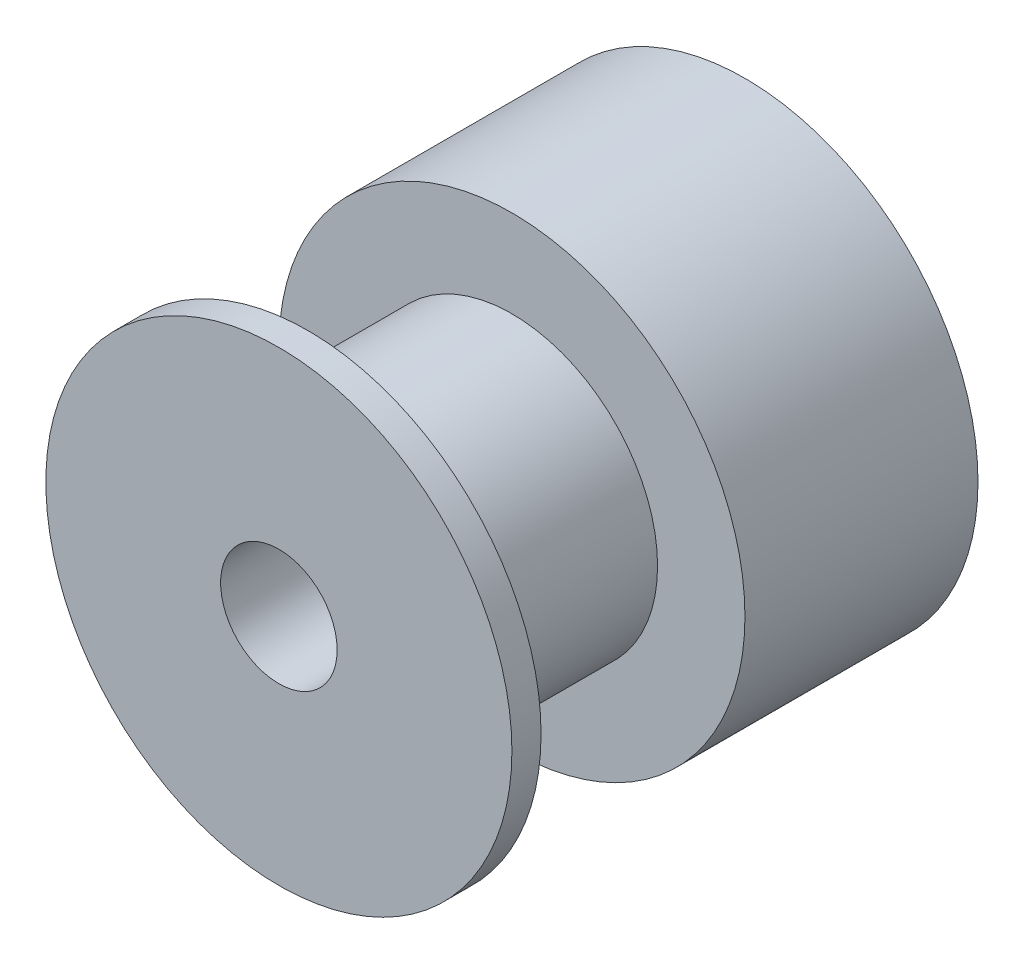
ISO-10303-21;
HEADER;
FILE_DESCRIPTION(('STEP AP214'),'2;1');
FILE_NAME('part.step','',(''),(''),'','','');
FILE_SCHEMA(('AUTOMOTIVE_DESIGN { 1 0 10303 214 1 1 1 1 }'));
ENDSEC;
DATA;
#1=APPLICATION_CONTEXT('core data for automotive mechanical design processes');
#2=APPLICATION_PROTOCOL_DEFINITION('international standard','automotive_design',2000,#1);
#3=PRODUCT_CONTEXT('',#1,'mechanical');
#4=PRODUCT('Part','Part','',(#3));
#5=PRODUCT_RELATED_PRODUCT_CATEGORY('part','',(#4));
#6=PRODUCT_DEFINITION_FORMATION('','',#4);
#7=PRODUCT_DEFINITION_CONTEXT('part definition',#1,'design');
#8=PRODUCT_DEFINITION('design','',#6,#7);
#9=PRODUCT_DEFINITION_SHAPE('','',#8);
#10=(LENGTH_UNIT() NAMED_UNIT(*) SI_UNIT(.MILLI.,.METRE.));
#11=(NAMED_UNIT(*) PLANE_ANGLE_UNIT() SI_UNIT($,.RADIAN.));
#12=(NAMED_UNIT(*) SI_UNIT($,.STERADIAN.) SOLID_ANGLE_UNIT());
#13=UNCERTAINTY_MEASURE_WITH_UNIT(LENGTH_MEASURE(1.E-05),#10,'distance_accuracy_value','');
#14=(GEOMETRIC_REPRESENTATION_CONTEXT(3) GLOBAL_UNCERTAINTY_ASSIGNED_CONTEXT((#13)) GLOBAL_UNIT_ASSIGNED_CONTEXT((#10,
#11,#12)) REPRESENTATION_CONTEXT('',''));
#15=CARTESIAN_POINT('',(0.,0.,0.));
#16=DIRECTION('',(0.,0.,1.));
#17=DIRECTION('',(1.,0.,0.));
#18=AXIS2_PLACEMENT_3D('',#15,#16,#17);
#19=CARTESIAN_POINT('',(0.,0.,8.));
#20=DIRECTION('',(0.,0.,1.));
#21=DIRECTION('',(1.,0.,0.));
#22=AXIS2_PLACEMENT_3D('',#19,#20,#21);
#23=PLANE('',#22);
#24=CARTESIAN_POINT('',(0.,0.,8.));
#25=DIRECTION('',(0.,0.,1.));
#26=DIRECTION('',(1.,0.,0.));
#27=AXIS2_PLACEMENT_3D('',#24,#25,#26);
#28=CIRCLE('',#27,8.);
#29=CARTESIAN_POINT('',(8.,0.,8.));
#30=VERTEX_POINT('',#29);
#31=EDGE_CURVE('E10',#30,#30,#28,.T.);
#32=ORIENTED_EDGE('',*,*,#31,.T.);
#33=EDGE_LOOP('',(#32));
#34=FACE_BOUND('',#33,.T.);
#35=CARTESIAN_POINT('',(0.,0.,8.));
#36=DIRECTION('',(0.,0.,1.));
#37=DIRECTION('',(1.,0.,0.));
#38=AXIS2_PLACEMENT_3D('',#35,#36,#37);
#39=CIRCLE('',#38,5.);
#40=CARTESIAN_POINT('',(5.,0.,8.));
#41=VERTEX_POINT('',#40);
#42=EDGE_CURVE('E55',#41,#41,#39,.T.);
#43=ORIENTED_EDGE('',*,*,#42,.F.);
#44=EDGE_LOOP('',(#43));
#45=FACE_BOUND('',#44,.T.);
#46=ADVANCED_FACE('F39',(#34,#45),#23,.T.);
#47=CARTESIAN_POINT('',(0.,0.,0.));
#48=DIRECTION('',(0.,0.,1.));
#49=DIRECTION('',(1.,0.,0.));
#50=AXIS2_PLACEMENT_3D('',#47,#48,#49);
#51=PLANE('',#50);
#52=CARTESIAN_POINT('',(0.,0.,0.));
#53=DIRECTION('',(0.,0.,1.));
#54=DIRECTION('',(1.,0.,0.));
#55=AXIS2_PLACEMENT_3D('',#52,#53,#54);
#56=CIRCLE('',#55,8.);
#57=CARTESIAN_POINT('',(8.,0.,0.));
#58=VERTEX_POINT('',#57);
#59=EDGE_CURVE('E43',#58,#58,#56,.T.);
#60=ORIENTED_EDGE('',*,*,#59,.F.);
#61=EDGE_LOOP('',(#60));
#62=FACE_BOUND('',#61,.T.);
#63=CARTESIAN_POINT('',(0.,0.,0.));
#64=DIRECTION('',(0.,0.,1.));
#65=DIRECTION('',(1.,0.,0.));
#66=AXIS2_PLACEMENT_3D('',#63,#64,#65);
#67=CIRCLE('',#66,2.);
#68=CARTESIAN_POINT('',(2.,0.,0.));
#69=VERTEX_POINT('',#68);
#70=EDGE_CURVE('E50',#69,#69,#67,.T.);
#71=ORIENTED_EDGE('',*,*,#70,.T.);
#72=EDGE_LOOP('',(#71));
#73=FACE_BOUND('',#72,.T.);
#74=ADVANCED_FACE('F89',(#62,#73),#51,.F.);
#75=CARTESIAN_POINT('',(0.,0.,8.));
#76=DIRECTION('',(0.,0.,-1.));
#77=DIRECTION('',(-1.,0.,0.));
#78=AXIS2_PLACEMENT_3D('',#75,#76,#77);
#79=CYLINDRICAL_SURFACE('',#78,8.);
#80=ORIENTED_EDGE('',*,*,#31,.F.);
#81=EDGE_LOOP('',(#80));
#82=FACE_BOUND('',#81,.T.);
#83=ORIENTED_EDGE('',*,*,#59,.T.);
#84=EDGE_LOOP('',(#83));
#85=FACE_BOUND('',#84,.T.);
#86=ADVANCED_FACE('F41',(#82,#85),#79,.T.);
#87=CARTESIAN_POINT('',(0.,0.,8.));
#88=DIRECTION('',(0.,0.,-1.));
#89=DIRECTION('',(-1.,0.,0.));
#90=AXIS2_PLACEMENT_3D('',#87,#88,#89);
#91=CYLINDRICAL_SURFACE('',#90,2.);
#92=ORIENTED_EDGE('',*,*,#70,.F.);
#93=EDGE_LOOP('',(#92));
#94=FACE_BOUND('',#93,.T.);
#95=CARTESIAN_POINT('',(0.,0.,16.));
#96=DIRECTION('',(0.,0.,1.));
#97=DIRECTION('',(1.,0.,0.));
#98=AXIS2_PLACEMENT_3D('',#95,#96,#97);
#99=CIRCLE('',#98,2.);
#100=CARTESIAN_POINT('',(2.,0.,16.));
#101=VERTEX_POINT('',#100);
#102=EDGE_CURVE('E64',#101,#101,#99,.T.);
#103=ORIENTED_EDGE('',*,*,#102,.T.);
#104=EDGE_LOOP('',(#103));
#105=FACE_BOUND('',#104,.T.);
#106=ADVANCED_FACE('F70',(#94,#105),#91,.F.);
#107=CARTESIAN_POINT('',(0.,0.,15.));
#108=DIRECTION('',(0.,0.,-1.));
#109=DIRECTION('',(-1.,0.,0.));
#110=AXIS2_PLACEMENT_3D('',#107,#108,#109);
#111=CYLINDRICAL_SURFACE('',#110,5.);
#112=CARTESIAN_POINT('',(0.,0.,15.));
#113=DIRECTION('',(0.,0.,1.));
#114=DIRECTION('',(1.,0.,0.));
#115=AXIS2_PLACEMENT_3D('',#112,#113,#114);
#116=CIRCLE('',#115,5.);
#117=CARTESIAN_POINT('',(5.,0.,15.));
#118=VERTEX_POINT('',#117);
#119=EDGE_CURVE('E54',#118,#118,#116,.T.);
#120=ORIENTED_EDGE('',*,*,#119,.F.);
#121=EDGE_LOOP('',(#120));
#122=FACE_BOUND('',#121,.T.);
#123=ORIENTED_EDGE('',*,*,#42,.T.);
#124=EDGE_LOOP('',(#123));
#125=FACE_BOUND('',#124,.T.);
#126=ADVANCED_FACE('F75',(#122,#125),#111,.T.);
#127=CARTESIAN_POINT('',(0.,0.,16.));
#128=DIRECTION('',(0.,0.,1.));
#129=DIRECTION('',(1.,0.,0.));
#130=AXIS2_PLACEMENT_3D('',#127,#128,#129);
#131=PLANE('',#130);
#132=CARTESIAN_POINT('',(0.,0.,16.));
#133=DIRECTION('',(0.,0.,1.));
#134=DIRECTION('',(1.,0.,0.));
#135=AXIS2_PLACEMENT_3D('',#132,#133,#134);
#136=CIRCLE('',#135,8.);
#137=CARTESIAN_POINT('',(8.,0.,16.));
#138=VERTEX_POINT('',#137);
#139=EDGE_CURVE('E58',#138,#138,#136,.T.);
#140=ORIENTED_EDGE('',*,*,#139,.T.);
#141=EDGE_LOOP('',(#140));
#142=FACE_BOUND('',#141,.T.);
#143=ORIENTED_EDGE('',*,*,#102,.F.);
#144=EDGE_LOOP('',(#143));
#145=FACE_BOUND('',#144,.T.);
#146=ADVANCED_FACE('F72',(#142,#145),#131,.T.);
#147=CARTESIAN_POINT('',(0.,0.,15.));
#148=DIRECTION('',(0.,0.,1.));
#149=DIRECTION('',(1.,0.,0.));
#150=AXIS2_PLACEMENT_3D('',#147,#148,#149);
#151=PLANE('',#150);
#152=ORIENTED_EDGE('',*,*,#119,.T.);
#153=EDGE_LOOP('',(#152));
#154=FACE_BOUND('',#153,.T.);
#155=CARTESIAN_POINT('',(0.,0.,15.));
#156=DIRECTION('',(0.,0.,1.));
#157=DIRECTION('',(1.,0.,0.));
#158=AXIS2_PLACEMENT_3D('',#155,#156,#157);
#159=CIRCLE('',#158,8.);
#160=CARTESIAN_POINT('',(8.,0.,15.));
#161=VERTEX_POINT('',#160);
#162=EDGE_CURVE('E61',#161,#161,#159,.T.);
#163=ORIENTED_EDGE('',*,*,#162,.F.);
#164=EDGE_LOOP('',(#163));
#165=FACE_BOUND('',#164,.T.);
#166=ADVANCED_FACE('F74',(#154,#165),#151,.F.);
#167=CARTESIAN_POINT('',(0.,0.,16.));
#168=DIRECTION('',(0.,0.,-1.));
#169=DIRECTION('',(-1.,0.,0.));
#170=AXIS2_PLACEMENT_3D('',#167,#168,#169);
#171=CYLINDRICAL_SURFACE('',#170,8.);
#172=ORIENTED_EDGE('',*,*,#139,.F.);
#173=EDGE_LOOP('',(#172));
#174=FACE_BOUND('',#173,.T.);
#175=ORIENTED_EDGE('',*,*,#162,.T.);
#176=EDGE_LOOP('',(#175));
#177=FACE_BOUND('',#176,.T.);
#178=ADVANCED_FACE('F82',(#174,#177),#171,.T.);
#179=CLOSED_SHELL('',(#46,#74,#86,#106,#126,#146,#166,#178));
#180=MANIFOLD_SOLID_BREP('B2',#179);
#181=ADVANCED_BREP_SHAPE_REPRESENTATION('',(#18,#180),#14);
#182=SHAPE_DEFINITION_REPRESENTATION(#9,#181);
ENDSEC;
END-ISO-10303-21;
